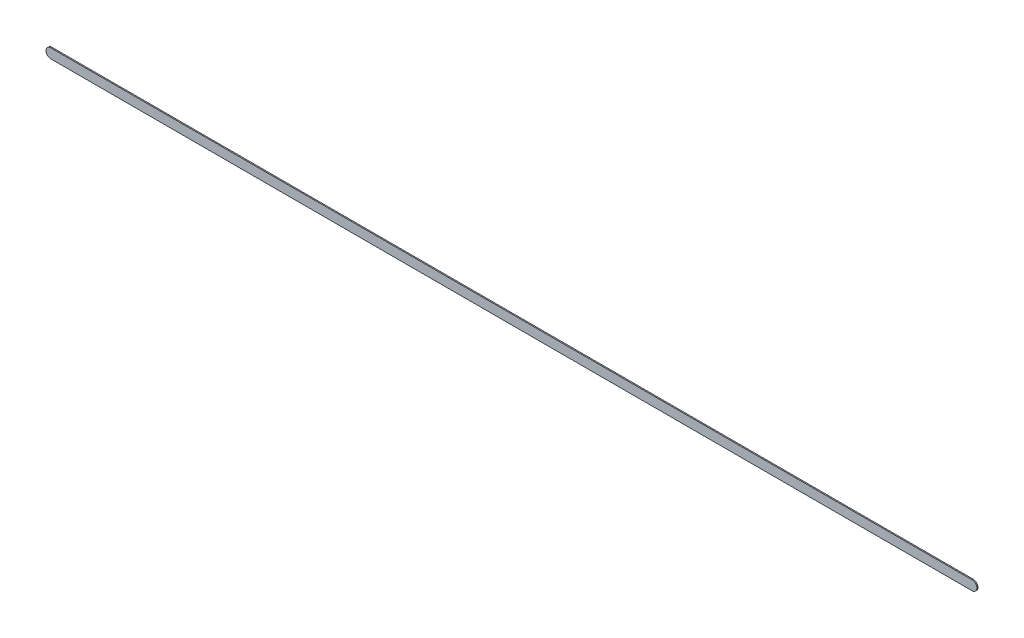
ISO-10303-21;
HEADER;
FILE_DESCRIPTION(('STEP AP214'),'2;1');
FILE_NAME('part.step','',(''),(''),'','','');
FILE_SCHEMA(('AUTOMOTIVE_DESIGN { 1 0 10303 214 1 1 1 1 }'));
ENDSEC;
DATA;
#1=APPLICATION_CONTEXT('core data for automotive mechanical design processes');
#2=APPLICATION_PROTOCOL_DEFINITION('international standard','automotive_design',2000,#1);
#3=PRODUCT_CONTEXT('',#1,'mechanical');
#4=PRODUCT('Part','Part','',(#3));
#5=PRODUCT_RELATED_PRODUCT_CATEGORY('part','',(#4));
#6=PRODUCT_DEFINITION_FORMATION('','',#4);
#7=PRODUCT_DEFINITION_CONTEXT('part definition',#1,'design');
#8=PRODUCT_DEFINITION('design','',#6,#7);
#9=PRODUCT_DEFINITION_SHAPE('','',#8);
#10=(LENGTH_UNIT() NAMED_UNIT(*) SI_UNIT(.MILLI.,.METRE.));
#11=(NAMED_UNIT(*) PLANE_ANGLE_UNIT() SI_UNIT($,.RADIAN.));
#12=(NAMED_UNIT(*) SI_UNIT($,.STERADIAN.) SOLID_ANGLE_UNIT());
#13=UNCERTAINTY_MEASURE_WITH_UNIT(LENGTH_MEASURE(1.E-05),#10,'distance_accuracy_value','');
#14=(GEOMETRIC_REPRESENTATION_CONTEXT(3) GLOBAL_UNCERTAINTY_ASSIGNED_CONTEXT((#13)) GLOBAL_UNIT_ASSIGNED_CONTEXT((#10,
#11,#12)) REPRESENTATION_CONTEXT('',''));
#15=CARTESIAN_POINT('',(0.,0.,0.));
#16=DIRECTION('',(0.,0.,1.));
#17=DIRECTION('',(1.,0.,0.));
#18=AXIS2_PLACEMENT_3D('',#15,#16,#17);
#19=CARTESIAN_POINT('',(121.565,-111.765,1.635));
#20=DIRECTION('',(0.,0.,1.));
#21=DIRECTION('',(1.,0.,0.));
#22=AXIS2_PLACEMENT_3D('',#19,#20,#21);
#23=PLANE('',#22);
#24=DIRECTION('',(-1.,0.,0.));
#25=VECTOR('',#24,1.);
#26=CARTESIAN_POINT('',(121.565,-111.765,1.635));
#27=LINE('',#26,#25);
#28=CARTESIAN_POINT('',(121.565,-111.765,1.635));
#29=VERTEX_POINT('',#28);
#30=CARTESIAN_POINT('',(92.59,-111.765,1.635));
#31=VERTEX_POINT('',#30);
#32=EDGE_CURVE('E95',#29,#31,#27,.T.);
#33=ORIENTED_EDGE('',*,*,#32,.T.);
#34=CARTESIAN_POINT('',(92.59,-111.915,1.635));
#35=DIRECTION('',(0.,0.,1.));
#36=DIRECTION('',(0.,1.,0.));
#37=AXIS2_PLACEMENT_3D('',#34,#35,#36);
#38=CIRCLE('',#37,0.15);
#39=CARTESIAN_POINT('',(92.59,-112.065,1.635));
#40=VERTEX_POINT('',#39);
#41=EDGE_CURVE('E91',#31,#40,#38,.T.);
#42=ORIENTED_EDGE('',*,*,#41,.T.);
#43=DIRECTION('',(1.,0.,0.));
#44=VECTOR('',#43,1.);
#45=CARTESIAN_POINT('',(92.59,-112.065,1.635));
#46=LINE('',#45,#44);
#47=CARTESIAN_POINT('',(121.565,-112.065,1.635));
#48=VERTEX_POINT('',#47);
#49=EDGE_CURVE('E49',#40,#48,#46,.T.);
#50=ORIENTED_EDGE('',*,*,#49,.T.);
#51=CARTESIAN_POINT('',(121.565,-111.915,1.635));
#52=DIRECTION('',(0.,0.,1.));
#53=DIRECTION('',(0.,-1.,0.));
#54=AXIS2_PLACEMENT_3D('',#51,#52,#53);
#55=CIRCLE('',#54,0.15);
#56=EDGE_CURVE('E11',#48,#29,#55,.T.);
#57=ORIENTED_EDGE('',*,*,#56,.T.);
#58=EDGE_LOOP('',(#33,#42,#50,#57));
#59=FACE_BOUND('',#58,.T.);
#60=ADVANCED_FACE('F17',(#59),#23,.T.);
#61=CARTESIAN_POINT('',(121.565,-111.765,1.6));
#62=DIRECTION('',(0.,0.,1.));
#63=DIRECTION('',(1.,0.,0.));
#64=AXIS2_PLACEMENT_3D('',#61,#62,#63);
#65=PLANE('',#64);
#66=CARTESIAN_POINT('',(121.565,-111.915,1.6));
#67=DIRECTION('',(0.,0.,1.));
#68=DIRECTION('',(0.,-1.,0.));
#69=AXIS2_PLACEMENT_3D('',#66,#67,#68);
#70=CIRCLE('',#69,0.15);
#71=CARTESIAN_POINT('',(121.565,-112.065,1.6));
#72=VERTEX_POINT('',#71);
#73=CARTESIAN_POINT('',(121.565,-111.765,1.6));
#74=VERTEX_POINT('',#73);
#75=EDGE_CURVE('E26',#72,#74,#70,.T.);
#76=ORIENTED_EDGE('',*,*,#75,.F.);
#77=DIRECTION('',(1.,0.,0.));
#78=VECTOR('',#77,1.);
#79=CARTESIAN_POINT('',(92.59,-112.065,1.6));
#80=LINE('',#79,#78);
#81=CARTESIAN_POINT('',(92.59,-112.065,1.6));
#82=VERTEX_POINT('',#81);
#83=EDGE_CURVE('E58',#82,#72,#80,.T.);
#84=ORIENTED_EDGE('',*,*,#83,.F.);
#85=CARTESIAN_POINT('',(92.59,-111.915,1.6));
#86=DIRECTION('',(0.,0.,1.));
#87=DIRECTION('',(0.,1.,0.));
#88=AXIS2_PLACEMENT_3D('',#85,#86,#87);
#89=CIRCLE('',#88,0.15);
#90=CARTESIAN_POINT('',(92.59,-111.765,1.6));
#91=VERTEX_POINT('',#90);
#92=EDGE_CURVE('E77',#91,#82,#89,.T.);
#93=ORIENTED_EDGE('',*,*,#92,.F.);
#94=DIRECTION('',(-1.,0.,0.));
#95=VECTOR('',#94,1.);
#96=CARTESIAN_POINT('',(121.565,-111.765,1.6));
#97=LINE('',#96,#95);
#98=EDGE_CURVE('E81',#74,#91,#97,.T.);
#99=ORIENTED_EDGE('',*,*,#98,.F.);
#100=EDGE_LOOP('',(#76,#84,#93,#99));
#101=FACE_BOUND('',#100,.T.);
#102=ADVANCED_FACE('F79',(#101),#65,.F.);
#103=CARTESIAN_POINT('',(121.565,-111.915,1.6));
#104=DIRECTION('',(0.,0.,-1.));
#105=DIRECTION('',(0.,-1.,0.));
#106=AXIS2_PLACEMENT_3D('',#103,#104,#105);
#107=CYLINDRICAL_SURFACE('',#106,0.15);
#108=ORIENTED_EDGE('',*,*,#75,.T.);
#109=DIRECTION('',(0.,0.,1.));
#110=VECTOR('',#109,1.);
#111=CARTESIAN_POINT('',(121.565,-111.765,1.6));
#112=LINE('',#111,#110);
#113=EDGE_CURVE('E86',#74,#29,#112,.T.);
#114=ORIENTED_EDGE('',*,*,#113,.T.);
#115=ORIENTED_EDGE('',*,*,#56,.F.);
#116=DIRECTION('',(0.,0.,1.));
#117=VECTOR('',#116,1.);
#118=CARTESIAN_POINT('',(121.565,-112.065,1.6));
#119=LINE('',#118,#117);
#120=EDGE_CURVE('E113',#72,#48,#119,.T.);
#121=ORIENTED_EDGE('',*,*,#120,.F.);
#122=EDGE_LOOP('',(#108,#114,#115,#121));
#123=FACE_BOUND('',#122,.T.);
#124=ADVANCED_FACE('F123',(#123),#107,.T.);
#125=CARTESIAN_POINT('',(92.59,-112.065,1.6));
#126=DIRECTION('',(0.,1.,0.));
#127=DIRECTION('',(1.,0.,0.));
#128=AXIS2_PLACEMENT_3D('',#125,#126,#127);
#129=PLANE('',#128);
#130=ORIENTED_EDGE('',*,*,#83,.T.);
#131=ORIENTED_EDGE('',*,*,#120,.T.);
#132=ORIENTED_EDGE('',*,*,#49,.F.);
#133=DIRECTION('',(0.,0.,1.));
#134=VECTOR('',#133,1.);
#135=CARTESIAN_POINT('',(92.59,-112.065,1.6));
#136=LINE('',#135,#134);
#137=EDGE_CURVE('E85',#82,#40,#136,.T.);
#138=ORIENTED_EDGE('',*,*,#137,.F.);
#139=EDGE_LOOP('',(#130,#131,#132,#138));
#140=FACE_BOUND('',#139,.T.);
#141=ADVANCED_FACE('F122',(#140),#129,.F.);
#142=CARTESIAN_POINT('',(92.59,-111.915,1.6));
#143=DIRECTION('',(0.,0.,-1.));
#144=DIRECTION('',(0.,1.,0.));
#145=AXIS2_PLACEMENT_3D('',#142,#143,#144);
#146=CYLINDRICAL_SURFACE('',#145,0.15);
#147=ORIENTED_EDGE('',*,*,#92,.T.);
#148=ORIENTED_EDGE('',*,*,#137,.T.);
#149=ORIENTED_EDGE('',*,*,#41,.F.);
#150=DIRECTION('',(0.,0.,1.));
#151=VECTOR('',#150,1.);
#152=CARTESIAN_POINT('',(92.59,-111.765,1.6));
#153=LINE('',#152,#151);
#154=EDGE_CURVE('E89',#91,#31,#153,.T.);
#155=ORIENTED_EDGE('',*,*,#154,.F.);
#156=EDGE_LOOP('',(#147,#148,#149,#155));
#157=FACE_BOUND('',#156,.T.);
#158=ADVANCED_FACE('F90',(#157),#146,.T.);
#159=CARTESIAN_POINT('',(121.565,-111.765,1.6));
#160=DIRECTION('',(0.,-1.,0.));
#161=DIRECTION('',(0.,0.,-1.));
#162=AXIS2_PLACEMENT_3D('',#159,#160,#161);
#163=PLANE('',#162);
#164=ORIENTED_EDGE('',*,*,#98,.T.);
#165=ORIENTED_EDGE('',*,*,#154,.T.);
#166=ORIENTED_EDGE('',*,*,#32,.F.);
#167=ORIENTED_EDGE('',*,*,#113,.F.);
#168=EDGE_LOOP('',(#164,#165,#166,#167));
#169=FACE_BOUND('',#168,.T.);
#170=ADVANCED_FACE('F98',(#169),#163,.F.);
#171=CLOSED_SHELL('',(#60,#102,#124,#141,#158,#170));
#172=MANIFOLD_SOLID_BREP('B1',#171);
#173=ADVANCED_BREP_SHAPE_REPRESENTATION('',(#18,#172),#14);
#174=SHAPE_DEFINITION_REPRESENTATION(#9,#173);
ENDSEC;
END-ISO-10303-21;
